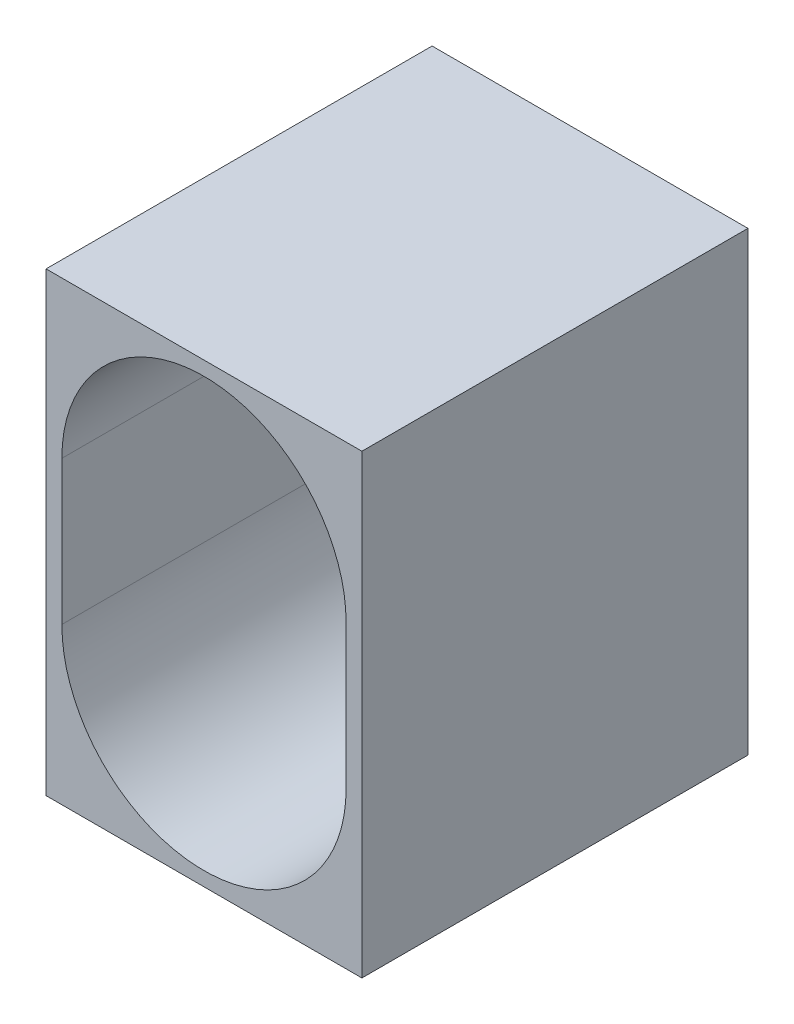
ISO-10303-21;
HEADER;
FILE_DESCRIPTION(('STEP AP214'),'2;1');
FILE_NAME('part.step','',(''),(''),'','','');
FILE_SCHEMA(('AUTOMOTIVE_DESIGN { 1 0 10303 214 1 1 1 1 }'));
ENDSEC;
DATA;
#1=APPLICATION_CONTEXT('core data for automotive mechanical design processes');
#2=APPLICATION_PROTOCOL_DEFINITION('international standard','automotive_design',2000,#1);
#3=PRODUCT_CONTEXT('',#1,'mechanical');
#4=PRODUCT('Part','Part','',(#3));
#5=PRODUCT_RELATED_PRODUCT_CATEGORY('part','',(#4));
#6=PRODUCT_DEFINITION_FORMATION('','',#4);
#7=PRODUCT_DEFINITION_CONTEXT('part definition',#1,'design');
#8=PRODUCT_DEFINITION('design','',#6,#7);
#9=PRODUCT_DEFINITION_SHAPE('','',#8);
#10=(LENGTH_UNIT() NAMED_UNIT(*) SI_UNIT(.MILLI.,.METRE.));
#11=(NAMED_UNIT(*) PLANE_ANGLE_UNIT() SI_UNIT($,.RADIAN.));
#12=(NAMED_UNIT(*) SI_UNIT($,.STERADIAN.) SOLID_ANGLE_UNIT());
#13=UNCERTAINTY_MEASURE_WITH_UNIT(LENGTH_MEASURE(1.E-05),#10,'distance_accuracy_value','');
#14=(GEOMETRIC_REPRESENTATION_CONTEXT(3) GLOBAL_UNCERTAINTY_ASSIGNED_CONTEXT((#13)) GLOBAL_UNIT_ASSIGNED_CONTEXT((#10,
#11,#12)) REPRESENTATION_CONTEXT('',''));
#15=CARTESIAN_POINT('',(0.,0.,0.));
#16=DIRECTION('',(0.,0.,1.));
#17=DIRECTION('',(1.,0.,0.));
#18=AXIS2_PLACEMENT_3D('',#15,#16,#17);
#19=CARTESIAN_POINT('',(-30.284904397773,20.560708190514,55.));
#20=DIRECTION('',(1.,0.,0.));
#21=DIRECTION('',(0.,1.,0.));
#22=AXIS2_PLACEMENT_3D('',#19,#20,#21);
#23=PLANE('',#22);
#24=DIRECTION('',(0.,-1.,0.));
#25=VECTOR('',#24,1.);
#26=CARTESIAN_POINT('',(-30.284904397773,20.560708190514,0.));
#27=LINE('',#26,#25);
#28=CARTESIAN_POINT('',(-30.284904397773,20.560708190514,0.));
#29=VERTEX_POINT('',#28);
#30=CARTESIAN_POINT('',(-30.2849043977729,-44.439291809486,0.));
#31=VERTEX_POINT('',#30);
#32=EDGE_CURVE('E163',#29,#31,#27,.T.);
#33=ORIENTED_EDGE('',*,*,#32,.T.);
#34=DIRECTION('',(0.,0.,-1.));
#35=VECTOR('',#34,1.);
#36=CARTESIAN_POINT('',(-30.2849043977729,-44.439291809486,55.));
#37=LINE('',#36,#35);
#38=CARTESIAN_POINT('',(-30.2849043977729,-44.439291809486,55.));
#39=VERTEX_POINT('',#38);
#40=EDGE_CURVE('E11',#39,#31,#37,.T.);
#41=ORIENTED_EDGE('',*,*,#40,.F.);
#42=DIRECTION('',(0.,-1.,0.));
#43=VECTOR('',#42,1.);
#44=CARTESIAN_POINT('',(-30.284904397773,20.560708190514,55.));
#45=LINE('',#44,#43);
#46=CARTESIAN_POINT('',(-30.284904397773,20.560708190514,55.));
#47=VERTEX_POINT('',#46);
#48=EDGE_CURVE('E169',#47,#39,#45,.T.);
#49=ORIENTED_EDGE('',*,*,#48,.F.);
#50=DIRECTION('',(0.,0.,-1.));
#51=VECTOR('',#50,1.);
#52=CARTESIAN_POINT('',(-30.284904397773,20.560708190514,55.));
#53=LINE('',#52,#51);
#54=EDGE_CURVE('E179',#47,#29,#53,.T.);
#55=ORIENTED_EDGE('',*,*,#54,.T.);
#56=EDGE_LOOP('',(#33,#41,#49,#55));
#57=FACE_BOUND('',#56,.T.);
#58=ADVANCED_FACE('F41',(#57),#23,.F.);
#59=CARTESIAN_POINT('',(-30.2849043977729,-44.439291809486,55.));
#60=DIRECTION('',(0.,1.,0.));
#61=DIRECTION('',(0.,0.,1.));
#62=AXIS2_PLACEMENT_3D('',#59,#60,#61);
#63=PLANE('',#62);
#64=DIRECTION('',(1.,0.,0.));
#65=VECTOR('',#64,1.);
#66=CARTESIAN_POINT('',(-30.2849043977729,-44.439291809486,0.));
#67=LINE('',#66,#65);
#68=CARTESIAN_POINT('',(14.7150956022271,-44.439291809486,0.));
#69=VERTEX_POINT('',#68);
#70=EDGE_CURVE('E183',#31,#69,#67,.T.);
#71=ORIENTED_EDGE('',*,*,#70,.T.);
#72=DIRECTION('',(0.,0.,-1.));
#73=VECTOR('',#72,1.);
#74=CARTESIAN_POINT('',(14.7150956022271,-44.439291809486,55.));
#75=LINE('',#74,#73);
#76=CARTESIAN_POINT('',(14.7150956022271,-44.439291809486,55.));
#77=VERTEX_POINT('',#76);
#78=EDGE_CURVE('E49',#77,#69,#75,.T.);
#79=ORIENTED_EDGE('',*,*,#78,.F.);
#80=DIRECTION('',(1.,0.,0.));
#81=VECTOR('',#80,1.);
#82=CARTESIAN_POINT('',(-30.2849043977729,-44.439291809486,55.));
#83=LINE('',#82,#81);
#84=EDGE_CURVE('E93',#39,#77,#83,.T.);
#85=ORIENTED_EDGE('',*,*,#84,.F.);
#86=ORIENTED_EDGE('',*,*,#40,.T.);
#87=EDGE_LOOP('',(#71,#79,#85,#86));
#88=FACE_BOUND('',#87,.T.);
#89=ADVANCED_FACE('F218',(#88),#63,.F.);
#90=CARTESIAN_POINT('',(14.715095602227,20.560708190514,55.));
#91=DIRECTION('',(-1.,0.,0.));
#92=DIRECTION('',(0.,-1.,0.));
#93=AXIS2_PLACEMENT_3D('',#90,#91,#92);
#94=PLANE('',#93);
#95=DIRECTION('',(0.,1.,0.));
#96=VECTOR('',#95,1.);
#97=CARTESIAN_POINT('',(14.715095602227,20.560708190514,0.));
#98=LINE('',#97,#96);
#99=CARTESIAN_POINT('',(14.715095602227,20.560708190514,0.));
#100=VERTEX_POINT('',#99);
#101=EDGE_CURVE('E186',#69,#100,#98,.T.);
#102=ORIENTED_EDGE('',*,*,#101,.T.);
#103=DIRECTION('',(0.,0.,-1.));
#104=VECTOR('',#103,1.);
#105=CARTESIAN_POINT('',(14.715095602227,20.560708190514,55.));
#106=LINE('',#105,#104);
#107=CARTESIAN_POINT('',(14.715095602227,20.560708190514,55.));
#108=VERTEX_POINT('',#107);
#109=EDGE_CURVE('E193',#108,#100,#106,.T.);
#110=ORIENTED_EDGE('',*,*,#109,.F.);
#111=DIRECTION('',(0.,1.,0.));
#112=VECTOR('',#111,1.);
#113=CARTESIAN_POINT('',(14.715095602227,20.560708190514,55.));
#114=LINE('',#113,#112);
#115=EDGE_CURVE('E174',#77,#108,#114,.T.);
#116=ORIENTED_EDGE('',*,*,#115,.F.);
#117=ORIENTED_EDGE('',*,*,#78,.T.);
#118=EDGE_LOOP('',(#102,#110,#116,#117));
#119=FACE_BOUND('',#118,.T.);
#120=ADVANCED_FACE('F200',(#119),#94,.F.);
#121=CARTESIAN_POINT('',(-30.284904397773,20.560708190514,55.));
#122=DIRECTION('',(0.,-1.,0.));
#123=DIRECTION('',(0.,0.,-1.));
#124=AXIS2_PLACEMENT_3D('',#121,#122,#123);
#125=PLANE('',#124);
#126=DIRECTION('',(-1.,0.,0.));
#127=VECTOR('',#126,1.);
#128=CARTESIAN_POINT('',(-30.284904397773,20.560708190514,0.));
#129=LINE('',#128,#127);
#130=EDGE_CURVE('E86',#100,#29,#129,.T.);
#131=ORIENTED_EDGE('',*,*,#130,.T.);
#132=ORIENTED_EDGE('',*,*,#54,.F.);
#133=DIRECTION('',(-1.,0.,0.));
#134=VECTOR('',#133,1.);
#135=CARTESIAN_POINT('',(-30.284904397773,20.560708190514,55.));
#136=LINE('',#135,#134);
#137=EDGE_CURVE('E65',#108,#47,#136,.T.);
#138=ORIENTED_EDGE('',*,*,#137,.F.);
#139=ORIENTED_EDGE('',*,*,#109,.T.);
#140=EDGE_LOOP('',(#131,#132,#138,#139));
#141=FACE_BOUND('',#140,.T.);
#142=ADVANCED_FACE('F208',(#141),#125,.F.);
#143=CARTESIAN_POINT('',(0.,0.,55.));
#144=DIRECTION('',(0.,0.,1.));
#145=DIRECTION('',(1.,0.,0.));
#146=AXIS2_PLACEMENT_3D('',#143,#144,#145);
#147=PLANE('',#146);
#148=CARTESIAN_POINT('',(-7.78490439777296,-22.189291809486,55.));
#149=DIRECTION('',(0.,0.,1.));
#150=DIRECTION('',(1.,0.,0.));
#151=AXIS2_PLACEMENT_3D('',#148,#149,#150);
#152=CIRCLE('',#151,20.25);
#153=CARTESIAN_POINT('',(-28.034904397773,-22.189291809486,55.));
#154=VERTEX_POINT('',#153);
#155=CARTESIAN_POINT('',(12.465095602227,-22.189291809486,55.));
#156=VERTEX_POINT('',#155);
#157=EDGE_CURVE('E56',#154,#156,#152,.T.);
#158=ORIENTED_EDGE('',*,*,#157,.F.);
#159=DIRECTION('',(0.,-1.,0.));
#160=VECTOR('',#159,1.);
#161=CARTESIAN_POINT('',(-28.034904397773,-22.189291809486,55.));
#162=LINE('',#161,#160);
#163=CARTESIAN_POINT('',(-28.034904397773,-1.68929180948604,55.));
#164=VERTEX_POINT('',#163);
#165=EDGE_CURVE('E138',#164,#154,#162,.T.);
#166=ORIENTED_EDGE('',*,*,#165,.F.);
#167=CARTESIAN_POINT('',(-7.78490439777296,-1.68929180948602,55.));
#168=DIRECTION('',(0.,0.,1.));
#169=DIRECTION('',(1.,0.,0.));
#170=AXIS2_PLACEMENT_3D('',#167,#168,#169);
#171=CIRCLE('',#170,20.25);
#172=CARTESIAN_POINT('',(12.465095602227,-1.689291809486,55.));
#173=VERTEX_POINT('',#172);
#174=EDGE_CURVE('E142',#173,#164,#171,.T.);
#175=ORIENTED_EDGE('',*,*,#174,.F.);
#176=DIRECTION('',(0.,1.,0.));
#177=VECTOR('',#176,1.);
#178=CARTESIAN_POINT('',(12.465095602227,-22.189291809486,55.));
#179=LINE('',#178,#177);
#180=EDGE_CURVE('E154',#156,#173,#179,.T.);
#181=ORIENTED_EDGE('',*,*,#180,.F.);
#182=EDGE_LOOP('',(#158,#166,#175,#181));
#183=FACE_BOUND('',#182,.T.);
#184=ORIENTED_EDGE('',*,*,#48,.T.);
#185=ORIENTED_EDGE('',*,*,#84,.T.);
#186=ORIENTED_EDGE('',*,*,#115,.T.);
#187=ORIENTED_EDGE('',*,*,#137,.T.);
#188=EDGE_LOOP('',(#184,#185,#186,#187));
#189=FACE_BOUND('',#188,.T.);
#190=ADVANCED_FACE('F210',(#183,#189),#147,.T.);
#191=CARTESIAN_POINT('',(0.,0.,0.));
#192=DIRECTION('',(0.,0.,1.));
#193=DIRECTION('',(1.,0.,0.));
#194=AXIS2_PLACEMENT_3D('',#191,#192,#193);
#195=PLANE('',#194);
#196=CARTESIAN_POINT('',(-7.78490439777295,-16.439291809486,0.));
#197=DIRECTION('',(0.,0.,-1.));
#198=DIRECTION('',(-1.,0.,0.));
#199=AXIS2_PLACEMENT_3D('',#196,#197,#198);
#200=CIRCLE('',#199,2.70509999999999);
#201=CARTESIAN_POINT('',(-10.4900043977729,-16.439291809486,0.));
#202=VERTEX_POINT('',#201);
#203=EDGE_CURVE('E313',#202,#202,#200,.T.);
#204=ORIENTED_EDGE('',*,*,#203,.F.);
#205=EDGE_LOOP('',(#204));
#206=FACE_BOUND('',#205,.T.);
#207=ORIENTED_EDGE('',*,*,#32,.F.);
#208=ORIENTED_EDGE('',*,*,#130,.F.);
#209=ORIENTED_EDGE('',*,*,#101,.F.);
#210=ORIENTED_EDGE('',*,*,#70,.F.);
#211=EDGE_LOOP('',(#207,#208,#209,#210));
#212=FACE_BOUND('',#211,.T.);
#213=ADVANCED_FACE('F204',(#206,#212),#195,.F.);
#214=CARTESIAN_POINT('',(-7.78490439777296,-22.189291809486,2.5));
#215=DIRECTION('',(0.,0.,1.));
#216=DIRECTION('',(1.,0.,0.));
#217=AXIS2_PLACEMENT_3D('',#214,#215,#216);
#218=CYLINDRICAL_SURFACE('',#217,20.25);
#219=ORIENTED_EDGE('',*,*,#157,.T.);
#220=DIRECTION('',(0.,0.,1.));
#221=VECTOR('',#220,1.);
#222=CARTESIAN_POINT('',(12.465095602227,-22.189291809486,2.5));
#223=LINE('',#222,#221);
#224=CARTESIAN_POINT('',(12.465095602227,-22.189291809486,2.5));
#225=VERTEX_POINT('',#224);
#226=EDGE_CURVE('E113',#225,#156,#223,.T.);
#227=ORIENTED_EDGE('',*,*,#226,.F.);
#228=CARTESIAN_POINT('',(-7.78490439777296,-22.189291809486,2.5));
#229=DIRECTION('',(0.,0.,1.));
#230=DIRECTION('',(1.,0.,0.));
#231=AXIS2_PLACEMENT_3D('',#228,#229,#230);
#232=CIRCLE('',#231,20.25);
#233=CARTESIAN_POINT('',(-28.034904397773,-22.189291809486,2.5));
#234=VERTEX_POINT('',#233);
#235=EDGE_CURVE('E117',#234,#225,#232,.T.);
#236=ORIENTED_EDGE('',*,*,#235,.F.);
#237=DIRECTION('',(0.,0.,1.));
#238=VECTOR('',#237,1.);
#239=CARTESIAN_POINT('',(-28.034904397773,-22.189291809486,2.5));
#240=LINE('',#239,#238);
#241=EDGE_CURVE('E160',#234,#154,#240,.T.);
#242=ORIENTED_EDGE('',*,*,#241,.T.);
#243=EDGE_LOOP('',(#219,#227,#236,#242));
#244=FACE_BOUND('',#243,.T.);
#245=ADVANCED_FACE('F115',(#244),#218,.F.);
#246=CARTESIAN_POINT('',(-28.034904397773,-22.189291809486,2.5));
#247=DIRECTION('',(-1.,0.,0.));
#248=DIRECTION('',(0.,0.,1.));
#249=AXIS2_PLACEMENT_3D('',#246,#247,#248);
#250=PLANE('',#249);
#251=ORIENTED_EDGE('',*,*,#165,.T.);
#252=ORIENTED_EDGE('',*,*,#241,.F.);
#253=DIRECTION('',(0.,-1.,0.));
#254=VECTOR('',#253,1.);
#255=CARTESIAN_POINT('',(-28.034904397773,-22.189291809486,2.5));
#256=LINE('',#255,#254);
#257=CARTESIAN_POINT('',(-28.034904397773,-1.68929180948604,2.5));
#258=VERTEX_POINT('',#257);
#259=EDGE_CURVE('E124',#258,#234,#256,.T.);
#260=ORIENTED_EDGE('',*,*,#259,.F.);
#261=DIRECTION('',(0.,0.,1.));
#262=VECTOR('',#261,1.);
#263=CARTESIAN_POINT('',(-28.034904397773,-1.68929180948604,2.5));
#264=LINE('',#263,#262);
#265=EDGE_CURVE('E164',#258,#164,#264,.T.);
#266=ORIENTED_EDGE('',*,*,#265,.T.);
#267=EDGE_LOOP('',(#251,#252,#260,#266));
#268=FACE_BOUND('',#267,.T.);
#269=ADVANCED_FACE('F252',(#268),#250,.F.);
#270=CARTESIAN_POINT('',(-7.78490439777296,-1.68929180948602,2.5));
#271=DIRECTION('',(0.,0.,1.));
#272=DIRECTION('',(1.,0.,0.));
#273=AXIS2_PLACEMENT_3D('',#270,#271,#272);
#274=CYLINDRICAL_SURFACE('',#273,20.25);
#275=ORIENTED_EDGE('',*,*,#174,.T.);
#276=ORIENTED_EDGE('',*,*,#265,.F.);
#277=CARTESIAN_POINT('',(-7.78490439777296,-1.68929180948602,2.5));
#278=DIRECTION('',(0.,0.,1.));
#279=DIRECTION('',(1.,0.,0.));
#280=AXIS2_PLACEMENT_3D('',#277,#278,#279);
#281=CIRCLE('',#280,20.25);
#282=CARTESIAN_POINT('',(12.465095602227,-1.689291809486,2.5));
#283=VERTEX_POINT('',#282);
#284=EDGE_CURVE('E133',#283,#258,#281,.T.);
#285=ORIENTED_EDGE('',*,*,#284,.F.);
#286=DIRECTION('',(0.,0.,1.));
#287=VECTOR('',#286,1.);
#288=CARTESIAN_POINT('',(12.465095602227,-1.689291809486,2.5));
#289=LINE('',#288,#287);
#290=EDGE_CURVE('E123',#283,#173,#289,.T.);
#291=ORIENTED_EDGE('',*,*,#290,.T.);
#292=EDGE_LOOP('',(#275,#276,#285,#291));
#293=FACE_BOUND('',#292,.T.);
#294=ADVANCED_FACE('F261',(#293),#274,.F.);
#295=CARTESIAN_POINT('',(12.465095602227,-22.189291809486,2.5));
#296=DIRECTION('',(1.,0.,0.));
#297=DIRECTION('',(0.,1.,0.));
#298=AXIS2_PLACEMENT_3D('',#295,#296,#297);
#299=PLANE('',#298);
#300=ORIENTED_EDGE('',*,*,#180,.T.);
#301=ORIENTED_EDGE('',*,*,#290,.F.);
#302=DIRECTION('',(0.,1.,0.));
#303=VECTOR('',#302,1.);
#304=CARTESIAN_POINT('',(12.465095602227,-22.189291809486,2.5));
#305=LINE('',#304,#303);
#306=EDGE_CURVE('E127',#225,#283,#305,.T.);
#307=ORIENTED_EDGE('',*,*,#306,.F.);
#308=ORIENTED_EDGE('',*,*,#226,.T.);
#309=EDGE_LOOP('',(#300,#301,#307,#308));
#310=FACE_BOUND('',#309,.T.);
#311=ADVANCED_FACE('F128',(#310),#299,.F.);
#312=CARTESIAN_POINT('',(-7.78490439777296,-22.189291809486,2.5));
#313=DIRECTION('',(0.,0.,1.));
#314=DIRECTION('',(1.,0.,0.));
#315=AXIS2_PLACEMENT_3D('',#312,#313,#314);
#316=PLANE('',#315);
#317=CARTESIAN_POINT('',(-7.78490439777295,-16.439291809486,2.5));
#318=DIRECTION('',(0.,0.,1.));
#319=DIRECTION('',(1.,0.,0.));
#320=AXIS2_PLACEMENT_3D('',#317,#318,#319);
#321=CIRCLE('',#320,2.70509999999999);
#322=CARTESIAN_POINT('',(-5.07980439777296,-16.439291809486,2.5));
#323=VERTEX_POINT('',#322);
#324=EDGE_CURVE('E145',#323,#323,#321,.T.);
#325=ORIENTED_EDGE('',*,*,#324,.F.);
#326=EDGE_LOOP('',(#325));
#327=FACE_BOUND('',#326,.T.);
#328=ORIENTED_EDGE('',*,*,#235,.T.);
#329=ORIENTED_EDGE('',*,*,#306,.T.);
#330=ORIENTED_EDGE('',*,*,#284,.T.);
#331=ORIENTED_EDGE('',*,*,#259,.T.);
#332=EDGE_LOOP('',(#328,#329,#330,#331));
#333=FACE_BOUND('',#332,.T.);
#334=ADVANCED_FACE('F135',(#327,#333),#316,.T.);
#335=CARTESIAN_POINT('',(-7.78490439777295,-16.439291809486,0.));
#336=DIRECTION('',(0.,0.,-1.));
#337=DIRECTION('',(-1.,0.,0.));
#338=AXIS2_PLACEMENT_3D('',#335,#336,#337);
#339=CYLINDRICAL_SURFACE('',#338,2.70509999999999);
#340=ORIENTED_EDGE('',*,*,#203,.T.);
#341=EDGE_LOOP('',(#340));
#342=FACE_BOUND('',#341,.T.);
#343=ORIENTED_EDGE('',*,*,#324,.T.);
#344=EDGE_LOOP('',(#343));
#345=FACE_BOUND('',#344,.T.);
#346=ADVANCED_FACE('F294',(#342,#345),#339,.F.);
#347=CLOSED_SHELL('',(#58,#89,#120,#142,#190,#213,#245,#269,#294,#311,#334,#346));
#348=MANIFOLD_SOLID_BREP('B2',#347);
#349=ADVANCED_BREP_SHAPE_REPRESENTATION('',(#18,#348),#14);
#350=SHAPE_DEFINITION_REPRESENTATION(#9,#349);
ENDSEC;
END-ISO-10303-21;
